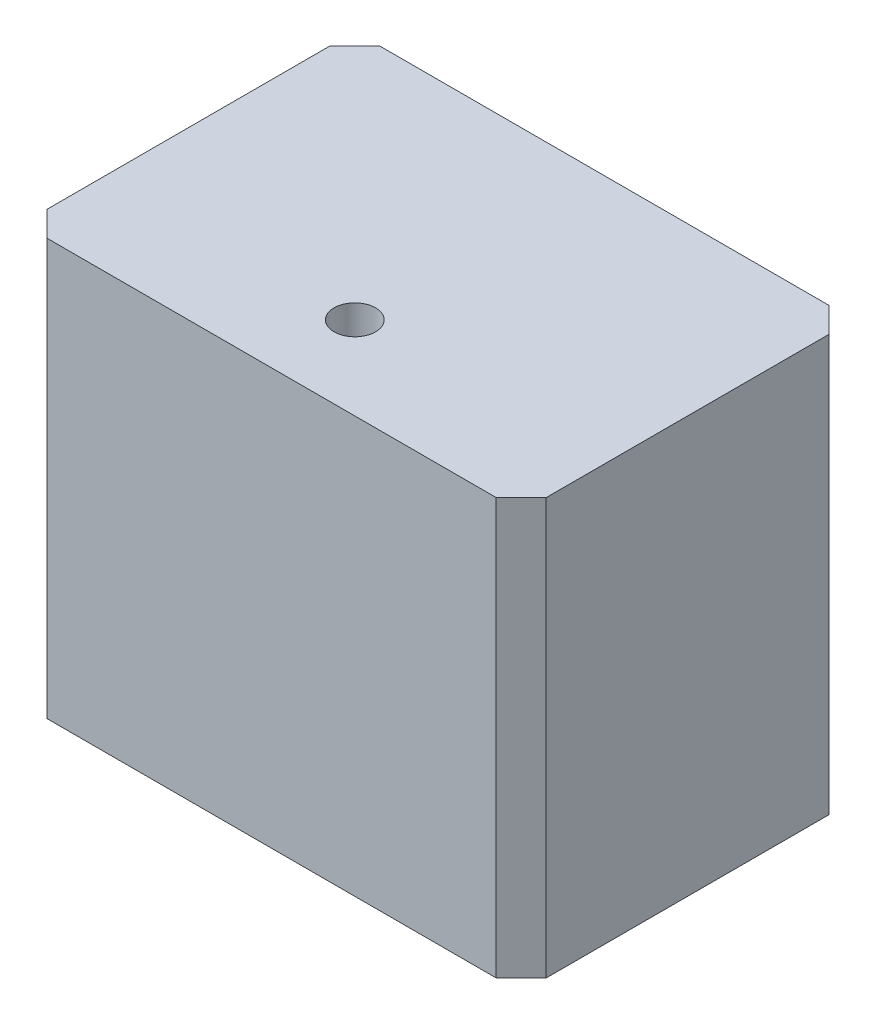
ISO-10303-21;
HEADER;
FILE_DESCRIPTION(('STEP AP214'),'2;1');
FILE_NAME('part.step','',(''),(''),'','','');
FILE_SCHEMA(('AUTOMOTIVE_DESIGN { 1 0 10303 214 1 1 1 1 }'));
ENDSEC;
DATA;
#1=APPLICATION_CONTEXT('core data for automotive mechanical design processes');
#2=APPLICATION_PROTOCOL_DEFINITION('international standard','automotive_design',2000,#1);
#3=PRODUCT_CONTEXT('',#1,'mechanical');
#4=PRODUCT('Part','Part','',(#3));
#5=PRODUCT_RELATED_PRODUCT_CATEGORY('part','',(#4));
#6=PRODUCT_DEFINITION_FORMATION('','',#4);
#7=PRODUCT_DEFINITION_CONTEXT('part definition',#1,'design');
#8=PRODUCT_DEFINITION('design','',#6,#7);
#9=PRODUCT_DEFINITION_SHAPE('','',#8);
#10=(LENGTH_UNIT() NAMED_UNIT(*) SI_UNIT(.MILLI.,.METRE.));
#11=(NAMED_UNIT(*) PLANE_ANGLE_UNIT() SI_UNIT($,.RADIAN.));
#12=(NAMED_UNIT(*) SI_UNIT($,.STERADIAN.) SOLID_ANGLE_UNIT());
#13=UNCERTAINTY_MEASURE_WITH_UNIT(LENGTH_MEASURE(1.E-05),#10,'distance_accuracy_value','');
#14=(GEOMETRIC_REPRESENTATION_CONTEXT(3) GLOBAL_UNCERTAINTY_ASSIGNED_CONTEXT((#13)) GLOBAL_UNIT_ASSIGNED_CONTEXT((#10,
#11,#12)) REPRESENTATION_CONTEXT('',''));
#15=CARTESIAN_POINT('',(0.,0.,0.));
#16=DIRECTION('',(0.,0.,1.));
#17=DIRECTION('',(1.,0.,0.));
#18=AXIS2_PLACEMENT_3D('',#15,#16,#17);
#19=CARTESIAN_POINT('',(-15.,25.,10.));
#20=DIRECTION('',(1.,0.,0.));
#21=DIRECTION('',(0.,0.,-1.));
#22=AXIS2_PLACEMENT_3D('',#19,#20,#21);
#23=PLANE('',#22);
#24=DIRECTION('',(0.,0.,1.));
#25=VECTOR('',#24,1.);
#26=CARTESIAN_POINT('',(-15.,25.,10.));
#27=LINE('',#26,#25);
#28=CARTESIAN_POINT('',(-15.,25.,-8.49999999999999));
#29=VERTEX_POINT('',#28);
#30=CARTESIAN_POINT('',(-15.,25.,8.49999999999999));
#31=VERTEX_POINT('',#30);
#32=EDGE_CURVE('E139',#29,#31,#27,.T.);
#33=ORIENTED_EDGE('',*,*,#32,.F.);
#34=DIRECTION('',(0.,-1.,0.));
#35=VECTOR('',#34,1.);
#36=CARTESIAN_POINT('',(-15.,25.,-8.49999999999999));
#37=LINE('',#36,#35);
#38=CARTESIAN_POINT('',(-15.,0.,-8.49999999999999));
#39=VERTEX_POINT('',#38);
#40=EDGE_CURVE('E173',#29,#39,#37,.T.);
#41=ORIENTED_EDGE('',*,*,#40,.T.);
#42=DIRECTION('',(0.,0.,1.));
#43=VECTOR('',#42,1.);
#44=CARTESIAN_POINT('',(-15.,0.,10.));
#45=LINE('',#44,#43);
#46=CARTESIAN_POINT('',(-15.,0.,8.49999999999999));
#47=VERTEX_POINT('',#46);
#48=EDGE_CURVE('E141',#39,#47,#45,.T.);
#49=ORIENTED_EDGE('',*,*,#48,.T.);
#50=DIRECTION('',(0.,1.,0.));
#51=VECTOR('',#50,1.);
#52=CARTESIAN_POINT('',(-15.,25.,8.49999999999999));
#53=LINE('',#52,#51);
#54=EDGE_CURVE('E170',#47,#31,#53,.T.);
#55=ORIENTED_EDGE('',*,*,#54,.T.);
#56=EDGE_LOOP('',(#33,#41,#49,#55));
#57=FACE_BOUND('',#56,.T.);
#58=ADVANCED_FACE('F39',(#57),#23,.F.);
#59=CARTESIAN_POINT('',(15.,25.,9.99999999999999));
#60=DIRECTION('',(0.,0.,-1.));
#61=DIRECTION('',(-1.,0.,0.));
#62=AXIS2_PLACEMENT_3D('',#59,#60,#61);
#63=PLANE('',#62);
#64=DIRECTION('',(1.,0.,0.));
#65=VECTOR('',#64,1.);
#66=CARTESIAN_POINT('',(15.,0.,9.99999999999999));
#67=LINE('',#66,#65);
#68=CARTESIAN_POINT('',(-13.5,0.,10.));
#69=VERTEX_POINT('',#68);
#70=CARTESIAN_POINT('',(13.5,0.,9.99999999999999));
#71=VERTEX_POINT('',#70);
#72=EDGE_CURVE('E135',#69,#71,#67,.T.);
#73=ORIENTED_EDGE('',*,*,#72,.T.);
#74=DIRECTION('',(0.,1.,0.));
#75=VECTOR('',#74,1.);
#76=CARTESIAN_POINT('',(13.5,25.,9.99999999999999));
#77=LINE('',#76,#75);
#78=CARTESIAN_POINT('',(13.5,25.,9.99999999999999));
#79=VERTEX_POINT('',#78);
#80=EDGE_CURVE('E110',#71,#79,#77,.T.);
#81=ORIENTED_EDGE('',*,*,#80,.T.);
#82=DIRECTION('',(1.,0.,0.));
#83=VECTOR('',#82,1.);
#84=CARTESIAN_POINT('',(15.,25.,9.99999999999999));
#85=LINE('',#84,#83);
#86=CARTESIAN_POINT('',(-13.5,25.,10.));
#87=VERTEX_POINT('',#86);
#88=EDGE_CURVE('E193',#87,#79,#85,.T.);
#89=ORIENTED_EDGE('',*,*,#88,.F.);
#90=DIRECTION('',(0.,-1.,0.));
#91=VECTOR('',#90,1.);
#92=CARTESIAN_POINT('',(-13.5,25.,10.));
#93=LINE('',#92,#91);
#94=EDGE_CURVE('E116',#87,#69,#93,.T.);
#95=ORIENTED_EDGE('',*,*,#94,.T.);
#96=EDGE_LOOP('',(#73,#81,#89,#95));
#97=FACE_BOUND('',#96,.T.);
#98=ADVANCED_FACE('F223',(#97),#63,.F.);
#99=CARTESIAN_POINT('',(15.,25.,9.99999999999999));
#100=DIRECTION('',(-1.,0.,0.));
#101=DIRECTION('',(0.,0.,1.));
#102=AXIS2_PLACEMENT_3D('',#99,#100,#101);
#103=PLANE('',#102);
#104=DIRECTION('',(0.,0.,-1.));
#105=VECTOR('',#104,1.);
#106=CARTESIAN_POINT('',(15.,25.,9.99999999999999));
#107=LINE('',#106,#105);
#108=CARTESIAN_POINT('',(15.,25.,8.49999999999999));
#109=VERTEX_POINT('',#108);
#110=CARTESIAN_POINT('',(15.,25.,-8.49999999999999));
#111=VERTEX_POINT('',#110);
#112=EDGE_CURVE('E125',#109,#111,#107,.T.);
#113=ORIENTED_EDGE('',*,*,#112,.F.);
#114=DIRECTION('',(0.,-1.,0.));
#115=VECTOR('',#114,1.);
#116=CARTESIAN_POINT('',(15.,25.,8.49999999999999));
#117=LINE('',#116,#115);
#118=CARTESIAN_POINT('',(15.,0.,8.49999999999999));
#119=VERTEX_POINT('',#118);
#120=EDGE_CURVE('E109',#109,#119,#117,.T.);
#121=ORIENTED_EDGE('',*,*,#120,.T.);
#122=DIRECTION('',(0.,0.,-1.));
#123=VECTOR('',#122,1.);
#124=CARTESIAN_POINT('',(15.,0.,9.99999999999999));
#125=LINE('',#124,#123);
#126=CARTESIAN_POINT('',(15.,0.,-8.49999999999999));
#127=VERTEX_POINT('',#126);
#128=EDGE_CURVE('E123',#119,#127,#125,.T.);
#129=ORIENTED_EDGE('',*,*,#128,.T.);
#130=DIRECTION('',(0.,1.,0.));
#131=VECTOR('',#130,1.);
#132=CARTESIAN_POINT('',(15.,25.,-8.49999999999999));
#133=LINE('',#132,#131);
#134=EDGE_CURVE('E128',#127,#111,#133,.T.);
#135=ORIENTED_EDGE('',*,*,#134,.T.);
#136=EDGE_LOOP('',(#113,#121,#129,#135));
#137=FACE_BOUND('',#136,.T.);
#138=ADVANCED_FACE('F122',(#137),#103,.F.);
#139=CARTESIAN_POINT('',(15.,25.,-10.));
#140=DIRECTION('',(0.,0.,1.));
#141=DIRECTION('',(1.,0.,0.));
#142=AXIS2_PLACEMENT_3D('',#139,#140,#141);
#143=PLANE('',#142);
#144=DIRECTION('',(-1.,0.,0.));
#145=VECTOR('',#144,1.);
#146=CARTESIAN_POINT('',(15.,0.,-10.));
#147=LINE('',#146,#145);
#148=CARTESIAN_POINT('',(13.5,0.,-10.));
#149=VERTEX_POINT('',#148);
#150=CARTESIAN_POINT('',(-13.5,0.,-10.));
#151=VERTEX_POINT('',#150);
#152=EDGE_CURVE('E134',#149,#151,#147,.T.);
#153=ORIENTED_EDGE('',*,*,#152,.T.);
#154=DIRECTION('',(0.,1.,0.));
#155=VECTOR('',#154,1.);
#156=CARTESIAN_POINT('',(-13.5,25.,-10.));
#157=LINE('',#156,#155);
#158=CARTESIAN_POINT('',(-13.5,25.,-10.));
#159=VERTEX_POINT('',#158);
#160=EDGE_CURVE('E11',#151,#159,#157,.T.);
#161=ORIENTED_EDGE('',*,*,#160,.T.);
#162=DIRECTION('',(-1.,0.,0.));
#163=VECTOR('',#162,1.);
#164=CARTESIAN_POINT('',(15.,25.,-10.));
#165=LINE('',#164,#163);
#166=CARTESIAN_POINT('',(13.5,25.,-10.));
#167=VERTEX_POINT('',#166);
#168=EDGE_CURVE('E146',#167,#159,#165,.T.);
#169=ORIENTED_EDGE('',*,*,#168,.F.);
#170=DIRECTION('',(0.,-1.,0.));
#171=VECTOR('',#170,1.);
#172=CARTESIAN_POINT('',(13.5,25.,-10.));
#173=LINE('',#172,#171);
#174=EDGE_CURVE('E48',#167,#149,#173,.T.);
#175=ORIENTED_EDGE('',*,*,#174,.T.);
#176=EDGE_LOOP('',(#153,#161,#169,#175));
#177=FACE_BOUND('',#176,.T.);
#178=ADVANCED_FACE('F179',(#177),#143,.F.);
#179=CARTESIAN_POINT('',(0.,25.,0.));
#180=DIRECTION('',(0.,1.,0.));
#181=DIRECTION('',(0.,0.,1.));
#182=AXIS2_PLACEMENT_3D('',#179,#180,#181);
#183=PLANE('',#182);
#184=CARTESIAN_POINT('',(0.,25.,5.));
#185=DIRECTION('',(0.,1.,0.));
#186=DIRECTION('',(0.,0.,1.));
#187=AXIS2_PLACEMENT_3D('',#184,#185,#186);
#188=CIRCLE('',#187,1.25);
#189=CARTESIAN_POINT('',(0.,25.,6.25));
#190=VERTEX_POINT('',#189);
#191=EDGE_CURVE('E199',#190,#190,#188,.T.);
#192=ORIENTED_EDGE('',*,*,#191,.F.);
#193=EDGE_LOOP('',(#192));
#194=FACE_BOUND('',#193,.T.);
#195=ORIENTED_EDGE('',*,*,#88,.T.);
#196=DIRECTION('',(-0.707106781186548,0.,0.707106781186547));
#197=VECTOR('',#196,1.);
#198=CARTESIAN_POINT('',(11.75,25.,11.75));
#199=LINE('',#198,#197);
#200=EDGE_CURVE('E167',#79,#109,#199,.F.);
#201=ORIENTED_EDGE('',*,*,#200,.T.);
#202=ORIENTED_EDGE('',*,*,#112,.T.);
#203=DIRECTION('',(0.707106781186547,0.,0.707106781186548));
#204=VECTOR('',#203,1.);
#205=CARTESIAN_POINT('',(11.75,25.,-11.75));
#206=LINE('',#205,#204);
#207=EDGE_CURVE('E60',#111,#167,#206,.F.);
#208=ORIENTED_EDGE('',*,*,#207,.T.);
#209=ORIENTED_EDGE('',*,*,#168,.T.);
#210=DIRECTION('',(0.707106781186548,0.,-0.707106781186547));
#211=VECTOR('',#210,1.);
#212=CARTESIAN_POINT('',(-11.75,25.,-11.75));
#213=LINE('',#212,#211);
#214=EDGE_CURVE('E164',#159,#29,#213,.F.);
#215=ORIENTED_EDGE('',*,*,#214,.T.);
#216=ORIENTED_EDGE('',*,*,#32,.T.);
#217=DIRECTION('',(-0.707106781186545,0.,-0.70710678118655));
#218=VECTOR('',#217,1.);
#219=CARTESIAN_POINT('',(-11.75,25.,11.75));
#220=LINE('',#219,#218);
#221=EDGE_CURVE('E159',#31,#87,#220,.F.);
#222=ORIENTED_EDGE('',*,*,#221,.T.);
#223=EDGE_LOOP('',(#195,#201,#202,#208,#209,#215,#216,#222));
#224=FACE_BOUND('',#223,.T.);
#225=ADVANCED_FACE('F217',(#194,#224),#183,.T.);
#226=CARTESIAN_POINT('',(0.,0.,0.));
#227=DIRECTION('',(0.,1.,0.));
#228=DIRECTION('',(0.,0.,1.));
#229=AXIS2_PLACEMENT_3D('',#226,#227,#228);
#230=PLANE('',#229);
#231=CARTESIAN_POINT('',(0.,0.,5.));
#232=DIRECTION('',(0.,1.,0.));
#233=DIRECTION('',(0.,0.,1.));
#234=AXIS2_PLACEMENT_3D('',#231,#232,#233);
#235=CIRCLE('',#234,1.25);
#236=CARTESIAN_POINT('',(0.,0.,6.25));
#237=VERTEX_POINT('',#236);
#238=EDGE_CURVE('E206',#237,#237,#235,.T.);
#239=ORIENTED_EDGE('',*,*,#238,.T.);
#240=EDGE_LOOP('',(#239));
#241=FACE_BOUND('',#240,.T.);
#242=ORIENTED_EDGE('',*,*,#128,.F.);
#243=DIRECTION('',(0.707106781186548,0.,-0.707106781186547));
#244=VECTOR('',#243,1.);
#245=CARTESIAN_POINT('',(15.,0.,8.49999999999999));
#246=LINE('',#245,#244);
#247=EDGE_CURVE('E105',#119,#71,#246,.F.);
#248=ORIENTED_EDGE('',*,*,#247,.T.);
#249=ORIENTED_EDGE('',*,*,#72,.F.);
#250=DIRECTION('',(0.707106781186545,0.,0.70710678118655));
#251=VECTOR('',#250,1.);
#252=CARTESIAN_POINT('',(-13.5,0.,10.));
#253=LINE('',#252,#251);
#254=EDGE_CURVE('E127',#69,#47,#253,.F.);
#255=ORIENTED_EDGE('',*,*,#254,.T.);
#256=ORIENTED_EDGE('',*,*,#48,.F.);
#257=DIRECTION('',(-0.707106781186548,0.,0.707106781186547));
#258=VECTOR('',#257,1.);
#259=CARTESIAN_POINT('',(-15.,0.,-8.49999999999999));
#260=LINE('',#259,#258);
#261=EDGE_CURVE('E117',#39,#151,#260,.F.);
#262=ORIENTED_EDGE('',*,*,#261,.T.);
#263=ORIENTED_EDGE('',*,*,#152,.F.);
#264=DIRECTION('',(-0.707106781186547,0.,-0.707106781186548));
#265=VECTOR('',#264,1.);
#266=CARTESIAN_POINT('',(13.5,0.,-10.));
#267=LINE('',#266,#265);
#268=EDGE_CURVE('E132',#149,#127,#267,.F.);
#269=ORIENTED_EDGE('',*,*,#268,.T.);
#270=EDGE_LOOP('',(#242,#248,#249,#255,#256,#262,#263,#269));
#271=FACE_BOUND('',#270,.T.);
#272=ADVANCED_FACE('F130',(#241,#271),#230,.F.);
#273=CARTESIAN_POINT('',(0.,0.,5.));
#274=DIRECTION('',(0.,1.,0.));
#275=DIRECTION('',(0.,0.,1.));
#276=AXIS2_PLACEMENT_3D('',#273,#274,#275);
#277=CYLINDRICAL_SURFACE('',#276,1.25);
#278=ORIENTED_EDGE('',*,*,#238,.F.);
#279=EDGE_LOOP('',(#278));
#280=FACE_BOUND('',#279,.T.);
#281=ORIENTED_EDGE('',*,*,#191,.T.);
#282=EDGE_LOOP('',(#281));
#283=FACE_BOUND('',#282,.T.);
#284=ADVANCED_FACE('F215',(#280,#283),#277,.F.);
#285=CARTESIAN_POINT('',(15.,25.,8.49999999999999));
#286=DIRECTION('',(-0.707106781186547,0.,-0.707106781186548));
#287=DIRECTION('',(0.,-1.,0.));
#288=AXIS2_PLACEMENT_3D('',#285,#286,#287);
#289=PLANE('',#288);
#290=ORIENTED_EDGE('',*,*,#200,.F.);
#291=ORIENTED_EDGE('',*,*,#80,.F.);
#292=ORIENTED_EDGE('',*,*,#247,.F.);
#293=ORIENTED_EDGE('',*,*,#120,.F.);
#294=EDGE_LOOP('',(#290,#291,#292,#293));
#295=FACE_BOUND('',#294,.T.);
#296=ADVANCED_FACE('F108',(#295),#289,.F.);
#297=CARTESIAN_POINT('',(-15.,25.,-8.49999999999999));
#298=DIRECTION('',(0.707106781186547,0.,0.707106781186548));
#299=DIRECTION('',(0.,-1.,0.));
#300=AXIS2_PLACEMENT_3D('',#297,#298,#299);
#301=PLANE('',#300);
#302=ORIENTED_EDGE('',*,*,#214,.F.);
#303=ORIENTED_EDGE('',*,*,#160,.F.);
#304=ORIENTED_EDGE('',*,*,#261,.F.);
#305=ORIENTED_EDGE('',*,*,#40,.F.);
#306=EDGE_LOOP('',(#302,#303,#304,#305));
#307=FACE_BOUND('',#306,.T.);
#308=ADVANCED_FACE('F186',(#307),#301,.F.);
#309=CARTESIAN_POINT('',(13.5,25.,-10.));
#310=DIRECTION('',(-0.707106781186548,0.,0.707106781186547));
#311=DIRECTION('',(0.,-1.,0.));
#312=AXIS2_PLACEMENT_3D('',#309,#310,#311);
#313=PLANE('',#312);
#314=ORIENTED_EDGE('',*,*,#207,.F.);
#315=ORIENTED_EDGE('',*,*,#134,.F.);
#316=ORIENTED_EDGE('',*,*,#268,.F.);
#317=ORIENTED_EDGE('',*,*,#174,.F.);
#318=EDGE_LOOP('',(#314,#315,#316,#317));
#319=FACE_BOUND('',#318,.T.);
#320=ADVANCED_FACE('F226',(#319),#313,.F.);
#321=CARTESIAN_POINT('',(-13.5,25.,10.));
#322=DIRECTION('',(0.70710678118655,0.,-0.707106781186545));
#323=DIRECTION('',(0.,-1.,0.));
#324=AXIS2_PLACEMENT_3D('',#321,#322,#323);
#325=PLANE('',#324);
#326=ORIENTED_EDGE('',*,*,#221,.F.);
#327=ORIENTED_EDGE('',*,*,#54,.F.);
#328=ORIENTED_EDGE('',*,*,#254,.F.);
#329=ORIENTED_EDGE('',*,*,#94,.F.);
#330=EDGE_LOOP('',(#326,#327,#328,#329));
#331=FACE_BOUND('',#330,.T.);
#332=ADVANCED_FACE('F41',(#331),#325,.F.);
#333=CLOSED_SHELL('',(#58,#98,#138,#178,#225,#272,#284,#296,#308,#320,#332));
#334=MANIFOLD_SOLID_BREP('B2',#333);
#335=ADVANCED_BREP_SHAPE_REPRESENTATION('',(#18,#334),#14);
#336=SHAPE_DEFINITION_REPRESENTATION(#9,#335);
ENDSEC;
END-ISO-10303-21;
